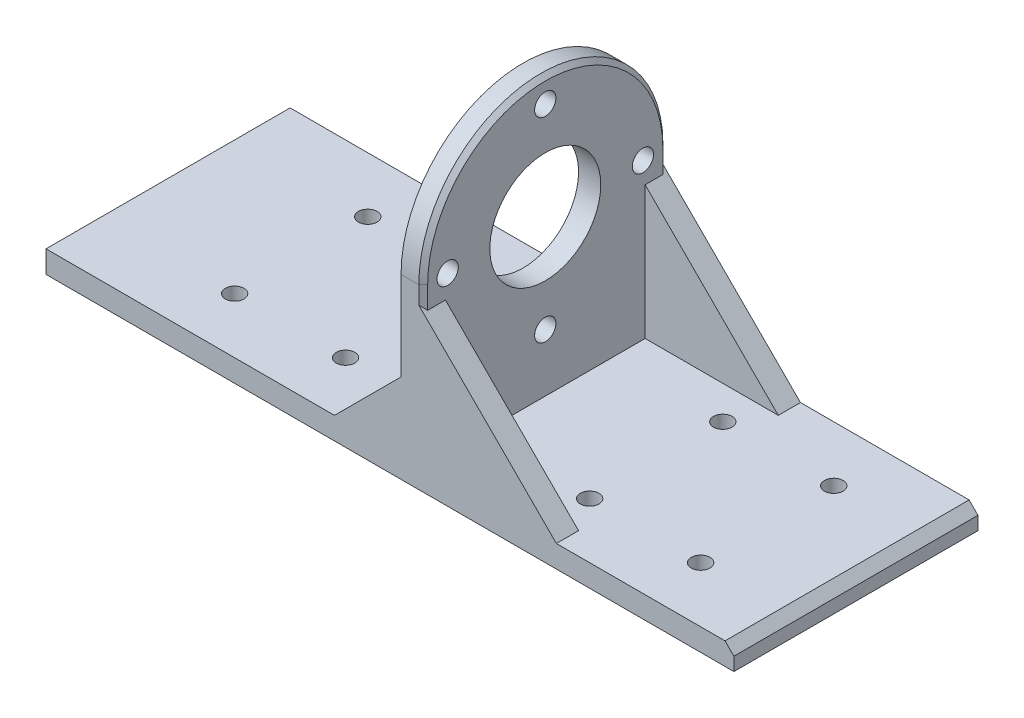
ISO-10303-21;
HEADER;
FILE_DESCRIPTION(('STEP AP214'),'2;1');
FILE_NAME('part.step','',(''),(''),'','','');
FILE_SCHEMA(('AUTOMOTIVE_DESIGN { 1 0 10303 214 1 1 1 1 }'));
ENDSEC;
DATA;
#1=APPLICATION_CONTEXT('core data for automotive mechanical design processes');
#2=APPLICATION_PROTOCOL_DEFINITION('international standard','automotive_design',2000,#1);
#3=PRODUCT_CONTEXT('',#1,'mechanical');
#4=PRODUCT('Part','Part','',(#3));
#5=PRODUCT_RELATED_PRODUCT_CATEGORY('part','',(#4));
#6=PRODUCT_DEFINITION_FORMATION('','',#4);
#7=PRODUCT_DEFINITION_CONTEXT('part definition',#1,'design');
#8=PRODUCT_DEFINITION('design','',#6,#7);
#9=PRODUCT_DEFINITION_SHAPE('','',#8);
#10=(LENGTH_UNIT() NAMED_UNIT(*) SI_UNIT(.MILLI.,.METRE.));
#11=(NAMED_UNIT(*) PLANE_ANGLE_UNIT() SI_UNIT($,.RADIAN.));
#12=(NAMED_UNIT(*) SI_UNIT($,.STERADIAN.) SOLID_ANGLE_UNIT());
#13=UNCERTAINTY_MEASURE_WITH_UNIT(LENGTH_MEASURE(1.E-05),#10,'distance_accuracy_value','');
#14=(GEOMETRIC_REPRESENTATION_CONTEXT(3) GLOBAL_UNCERTAINTY_ASSIGNED_CONTEXT((#13)) GLOBAL_UNIT_ASSIGNED_CONTEXT((#10,
#11,#12)) REPRESENTATION_CONTEXT('',''));
#15=CARTESIAN_POINT('',(0.,0.,0.));
#16=DIRECTION('',(0.,0.,1.));
#17=DIRECTION('',(1.,0.,0.));
#18=AXIS2_PLACEMENT_3D('',#15,#16,#17);
#19=CARTESIAN_POINT('',(5.,0.,0.));
#20=DIRECTION('',(1.,0.,0.));
#21=DIRECTION('',(0.,0.,-1.));
#22=AXIS2_PLACEMENT_3D('',#19,#20,#21);
#23=PLANE('',#22);
#24=DIRECTION('',(0.,0.,-1.));
#25=VECTOR('',#24,1.);
#26=CARTESIAN_POINT('',(5.,-5.00000000000001,0.));
#27=LINE('',#26,#25);
#28=CARTESIAN_POINT('',(5.,-5.00000000000001,-26.5));
#29=VERTEX_POINT('',#28);
#30=CARTESIAN_POINT('',(5.,-5.00000000000001,-22.5));
#31=VERTEX_POINT('',#30);
#32=EDGE_CURVE('E201',#29,#31,#27,.F.);
#33=ORIENTED_EDGE('',*,*,#32,.F.);
#34=DIRECTION('',(0.,1.,0.));
#35=VECTOR('',#34,1.);
#36=CARTESIAN_POINT('',(5.,0.,-26.5));
#37=LINE('',#36,#35);
#38=CARTESIAN_POINT('',(5.,0.,-26.5));
#39=VERTEX_POINT('',#38);
#40=EDGE_CURVE('E407',#29,#39,#37,.T.);
#41=ORIENTED_EDGE('',*,*,#40,.T.);
#42=CARTESIAN_POINT('',(5.,0.,0.));
#43=DIRECTION('',(1.,0.,0.));
#44=DIRECTION('',(0.,0.,-1.));
#45=AXIS2_PLACEMENT_3D('',#42,#43,#44);
#46=CIRCLE('',#45,26.5);
#47=CARTESIAN_POINT('',(5.,0.,26.5));
#48=VERTEX_POINT('',#47);
#49=EDGE_CURVE('E187',#39,#48,#46,.T.);
#50=ORIENTED_EDGE('',*,*,#49,.T.);
#51=DIRECTION('',(0.,-1.,0.));
#52=VECTOR('',#51,1.);
#53=CARTESIAN_POINT('',(5.,-5.00000000000002,26.5));
#54=LINE('',#53,#52);
#55=CARTESIAN_POINT('',(5.,-5.00000000000001,26.5));
#56=VERTEX_POINT('',#55);
#57=EDGE_CURVE('E404',#48,#56,#54,.T.);
#58=ORIENTED_EDGE('',*,*,#57,.T.);
#59=DIRECTION('',(0.,0.,1.));
#60=VECTOR('',#59,1.);
#61=CARTESIAN_POINT('',(5.,-5.00000000000001,0.));
#62=LINE('',#61,#60);
#63=CARTESIAN_POINT('',(5.,-5.00000000000001,22.5));
#64=VERTEX_POINT('',#63);
#65=EDGE_CURVE('E228',#64,#56,#62,.T.);
#66=ORIENTED_EDGE('',*,*,#65,.F.);
#67=DIRECTION('',(0.,-1.,0.));
#68=VECTOR('',#67,1.);
#69=CARTESIAN_POINT('',(5.,0.,22.5));
#70=LINE('',#69,#68);
#71=CARTESIAN_POINT('',(5.,-35.,22.5));
#72=VERTEX_POINT('',#71);
#73=EDGE_CURVE('E221',#64,#72,#70,.T.);
#74=ORIENTED_EDGE('',*,*,#73,.T.);
#75=DIRECTION('',(0.,0.,1.));
#76=VECTOR('',#75,1.);
#77=CARTESIAN_POINT('',(5.,-35.,27.5));
#78=LINE('',#77,#76);
#79=CARTESIAN_POINT('',(5.,-35.,-22.5));
#80=VERTEX_POINT('',#79);
#81=EDGE_CURVE('E232',#80,#72,#78,.T.);
#82=ORIENTED_EDGE('',*,*,#81,.F.);
#83=DIRECTION('',(0.,1.,0.));
#84=VECTOR('',#83,1.);
#85=CARTESIAN_POINT('',(5.,0.,-22.5));
#86=LINE('',#85,#84);
#87=EDGE_CURVE('E195',#80,#31,#86,.T.);
#88=ORIENTED_EDGE('',*,*,#87,.T.);
#89=EDGE_LOOP('',(#33,#41,#50,#58,#66,#74,#82,#88));
#90=FACE_BOUND('',#89,.T.);
#91=CARTESIAN_POINT('',(5.,-22.,0.));
#92=DIRECTION('',(1.,0.,0.));
#93=DIRECTION('',(0.,0.,-1.));
#94=AXIS2_PLACEMENT_3D('',#91,#92,#93);
#95=CIRCLE('',#94,2.4);
#96=CARTESIAN_POINT('',(5.,-22.,-2.4));
#97=VERTEX_POINT('',#96);
#98=EDGE_CURVE('E312',#97,#97,#95,.T.);
#99=ORIENTED_EDGE('',*,*,#98,.F.);
#100=EDGE_LOOP('',(#99));
#101=FACE_BOUND('',#100,.T.);
#102=CARTESIAN_POINT('',(5.,22.,0.));
#103=DIRECTION('',(1.,0.,0.));
#104=DIRECTION('',(0.,0.,-1.));
#105=AXIS2_PLACEMENT_3D('',#102,#103,#104);
#106=CIRCLE('',#105,2.4);
#107=CARTESIAN_POINT('',(5.,22.,-2.4));
#108=VERTEX_POINT('',#107);
#109=EDGE_CURVE('E328',#108,#108,#106,.T.);
#110=ORIENTED_EDGE('',*,*,#109,.F.);
#111=EDGE_LOOP('',(#110));
#112=FACE_BOUND('',#111,.T.);
#113=CARTESIAN_POINT('',(5.,0.,0.));
#114=DIRECTION('',(1.,0.,0.));
#115=DIRECTION('',(0.,0.,-1.));
#116=AXIS2_PLACEMENT_3D('',#113,#114,#115);
#117=CIRCLE('',#116,12.5);
#118=CARTESIAN_POINT('',(5.,0.,-12.5));
#119=VERTEX_POINT('',#118);
#120=EDGE_CURVE('E336',#119,#119,#117,.T.);
#121=ORIENTED_EDGE('',*,*,#120,.F.);
#122=EDGE_LOOP('',(#121));
#123=FACE_BOUND('',#122,.T.);
#124=CARTESIAN_POINT('',(5.,0.,-22.));
#125=DIRECTION('',(1.,0.,0.));
#126=DIRECTION('',(0.,0.,-1.));
#127=AXIS2_PLACEMENT_3D('',#124,#125,#126);
#128=CIRCLE('',#127,2.4);
#129=CARTESIAN_POINT('',(5.,0.,-24.4));
#130=VERTEX_POINT('',#129);
#131=EDGE_CURVE('E320',#130,#130,#128,.T.);
#132=ORIENTED_EDGE('',*,*,#131,.F.);
#133=EDGE_LOOP('',(#132));
#134=FACE_BOUND('',#133,.T.);
#135=CARTESIAN_POINT('',(5.,0.,22.));
#136=DIRECTION('',(1.,0.,0.));
#137=DIRECTION('',(0.,0.,-1.));
#138=AXIS2_PLACEMENT_3D('',#135,#136,#137);
#139=CIRCLE('',#138,2.4);
#140=CARTESIAN_POINT('',(5.,0.,19.6));
#141=VERTEX_POINT('',#140);
#142=EDGE_CURVE('E304',#141,#141,#139,.T.);
#143=ORIENTED_EDGE('',*,*,#142,.F.);
#144=EDGE_LOOP('',(#143));
#145=FACE_BOUND('',#144,.T.);
#146=ADVANCED_FACE('F42',(#90,#101,#112,#123,#134,#145),#23,.T.);
#147=CARTESIAN_POINT('',(0.,0.,0.));
#148=DIRECTION('',(1.,0.,0.));
#149=DIRECTION('',(0.,0.,-1.));
#150=AXIS2_PLACEMENT_3D('',#147,#148,#149);
#151=PLANE('',#150);
#152=CARTESIAN_POINT('',(0.,0.,-22.));
#153=DIRECTION('',(1.,0.,0.));
#154=DIRECTION('',(0.,0.,-1.));
#155=AXIS2_PLACEMENT_3D('',#152,#153,#154);
#156=CIRCLE('',#155,2.4);
#157=CARTESIAN_POINT('',(0.,0.,-24.4));
#158=VERTEX_POINT('',#157);
#159=EDGE_CURVE('E316',#158,#158,#156,.T.);
#160=ORIENTED_EDGE('',*,*,#159,.T.);
#161=EDGE_LOOP('',(#160));
#162=FACE_BOUND('',#161,.T.);
#163=CARTESIAN_POINT('',(0.,0.,0.));
#164=DIRECTION('',(1.,0.,0.));
#165=DIRECTION('',(0.,0.,-1.));
#166=AXIS2_PLACEMENT_3D('',#163,#164,#165);
#167=CIRCLE('',#166,27.5);
#168=CARTESIAN_POINT('',(0.,0.,-27.5));
#169=VERTEX_POINT('',#168);
#170=CARTESIAN_POINT('',(0.,0.,27.5));
#171=VERTEX_POINT('',#170);
#172=EDGE_CURVE('E340',#169,#171,#167,.T.);
#173=ORIENTED_EDGE('',*,*,#172,.F.);
#174=DIRECTION('',(0.,1.,0.));
#175=VECTOR('',#174,1.);
#176=CARTESIAN_POINT('',(0.,-40.,-27.5));
#177=LINE('',#176,#175);
#178=CARTESIAN_POINT('',(0.,-20.,-27.5));
#179=VERTEX_POINT('',#178);
#180=EDGE_CURVE('E351',#179,#169,#177,.T.);
#181=ORIENTED_EDGE('',*,*,#180,.F.);
#182=DIRECTION('',(0.,0.,1.));
#183=VECTOR('',#182,1.);
#184=CARTESIAN_POINT('',(0.,-20.,0.));
#185=LINE('',#184,#183);
#186=CARTESIAN_POINT('',(0.,-20.,-22.5));
#187=VERTEX_POINT('',#186);
#188=EDGE_CURVE('E262',#179,#187,#185,.T.);
#189=ORIENTED_EDGE('',*,*,#188,.T.);
#190=DIRECTION('',(0.,1.,0.));
#191=VECTOR('',#190,1.);
#192=CARTESIAN_POINT('',(0.,0.,-22.5));
#193=LINE('',#192,#191);
#194=CARTESIAN_POINT('',(0.,-33.,-22.5));
#195=VERTEX_POINT('',#194);
#196=EDGE_CURVE('E256',#195,#187,#193,.T.);
#197=ORIENTED_EDGE('',*,*,#196,.F.);
#198=DIRECTION('',(0.,0.,1.));
#199=VECTOR('',#198,1.);
#200=CARTESIAN_POINT('',(0.,-33.,0.));
#201=LINE('',#200,#199);
#202=CARTESIAN_POINT('',(0.,-33.,22.5));
#203=VERTEX_POINT('',#202);
#204=EDGE_CURVE('E382',#195,#203,#201,.T.);
#205=ORIENTED_EDGE('',*,*,#204,.T.);
#206=DIRECTION('',(0.,-1.,0.));
#207=VECTOR('',#206,1.);
#208=CARTESIAN_POINT('',(0.,0.,22.5));
#209=LINE('',#208,#207);
#210=CARTESIAN_POINT('',(0.,-20.,22.5));
#211=VERTEX_POINT('',#210);
#212=EDGE_CURVE('E270',#211,#203,#209,.T.);
#213=ORIENTED_EDGE('',*,*,#212,.F.);
#214=DIRECTION('',(0.,0.,-1.));
#215=VECTOR('',#214,1.);
#216=CARTESIAN_POINT('',(0.,-20.,0.));
#217=LINE('',#216,#215);
#218=CARTESIAN_POINT('',(0.,-20.,27.5));
#219=VERTEX_POINT('',#218);
#220=EDGE_CURVE('E277',#211,#219,#217,.F.);
#221=ORIENTED_EDGE('',*,*,#220,.T.);
#222=DIRECTION('',(0.,-1.,0.));
#223=VECTOR('',#222,1.);
#224=CARTESIAN_POINT('',(0.,0.,27.5));
#225=LINE('',#224,#223);
#226=EDGE_CURVE('E347',#171,#219,#225,.T.);
#227=ORIENTED_EDGE('',*,*,#226,.F.);
#228=EDGE_LOOP('',(#173,#181,#189,#197,#205,#213,#221,#227));
#229=FACE_BOUND('',#228,.T.);
#230=CARTESIAN_POINT('',(0.,0.,0.));
#231=DIRECTION('',(1.,0.,0.));
#232=DIRECTION('',(0.,0.,-1.));
#233=AXIS2_PLACEMENT_3D('',#230,#231,#232);
#234=CIRCLE('',#233,12.5);
#235=CARTESIAN_POINT('',(0.,0.,-12.5));
#236=VERTEX_POINT('',#235);
#237=EDGE_CURVE('E332',#236,#236,#234,.T.);
#238=ORIENTED_EDGE('',*,*,#237,.T.);
#239=EDGE_LOOP('',(#238));
#240=FACE_BOUND('',#239,.T.);
#241=CARTESIAN_POINT('',(0.,22.,0.));
#242=DIRECTION('',(1.,0.,0.));
#243=DIRECTION('',(0.,0.,-1.));
#244=AXIS2_PLACEMENT_3D('',#241,#242,#243);
#245=CIRCLE('',#244,2.4);
#246=CARTESIAN_POINT('',(0.,22.,-2.4));
#247=VERTEX_POINT('',#246);
#248=EDGE_CURVE('E324',#247,#247,#245,.T.);
#249=ORIENTED_EDGE('',*,*,#248,.T.);
#250=EDGE_LOOP('',(#249));
#251=FACE_BOUND('',#250,.T.);
#252=CARTESIAN_POINT('',(0.,-22.,0.));
#253=DIRECTION('',(1.,0.,0.));
#254=DIRECTION('',(0.,0.,-1.));
#255=AXIS2_PLACEMENT_3D('',#252,#253,#254);
#256=CIRCLE('',#255,2.4);
#257=CARTESIAN_POINT('',(0.,-22.,-2.4));
#258=VERTEX_POINT('',#257);
#259=EDGE_CURVE('E308',#258,#258,#256,.T.);
#260=ORIENTED_EDGE('',*,*,#259,.T.);
#261=EDGE_LOOP('',(#260));
#262=FACE_BOUND('',#261,.T.);
#263=CARTESIAN_POINT('',(0.,0.,22.));
#264=DIRECTION('',(1.,0.,0.));
#265=DIRECTION('',(0.,0.,-1.));
#266=AXIS2_PLACEMENT_3D('',#263,#264,#265);
#267=CIRCLE('',#266,2.4);
#268=CARTESIAN_POINT('',(0.,0.,19.6));
#269=VERTEX_POINT('',#268);
#270=EDGE_CURVE('E300',#269,#269,#267,.T.);
#271=ORIENTED_EDGE('',*,*,#270,.T.);
#272=EDGE_LOOP('',(#271));
#273=FACE_BOUND('',#272,.T.);
#274=ADVANCED_FACE('F467',(#162,#229,#240,#251,#262,#273),#151,.F.);
#275=CARTESIAN_POINT('',(5.,0.,0.));
#276=DIRECTION('',(-1.,0.,0.));
#277=DIRECTION('',(0.,0.,1.));
#278=AXIS2_PLACEMENT_3D('',#275,#276,#277);
#279=CYLINDRICAL_SURFACE('',#278,27.5);
#280=DIRECTION('',(-1.,0.,0.));
#281=VECTOR('',#280,1.);
#282=CARTESIAN_POINT('',(5.,0.,27.5));
#283=LINE('',#282,#281);
#284=CARTESIAN_POINT('',(3.99999999999999,0.,27.5));
#285=VERTEX_POINT('',#284);
#286=EDGE_CURVE('E365',#285,#171,#283,.T.);
#287=ORIENTED_EDGE('',*,*,#286,.F.);
#288=CARTESIAN_POINT('',(3.99999999999999,0.,0.));
#289=DIRECTION('',(1.,0.,0.));
#290=DIRECTION('',(0.,0.,-1.));
#291=AXIS2_PLACEMENT_3D('',#288,#289,#290);
#292=CIRCLE('',#291,27.5);
#293=CARTESIAN_POINT('',(3.99999999999999,0.,-27.5));
#294=VERTEX_POINT('',#293);
#295=EDGE_CURVE('E418',#285,#294,#292,.F.);
#296=ORIENTED_EDGE('',*,*,#295,.T.);
#297=DIRECTION('',(-1.,0.,0.));
#298=VECTOR('',#297,1.);
#299=CARTESIAN_POINT('',(5.,0.,-27.5));
#300=LINE('',#299,#298);
#301=EDGE_CURVE('E355',#294,#169,#300,.T.);
#302=ORIENTED_EDGE('',*,*,#301,.T.);
#303=ORIENTED_EDGE('',*,*,#172,.T.);
#304=EDGE_LOOP('',(#287,#296,#302,#303));
#305=FACE_BOUND('',#304,.T.);
#306=ADVANCED_FACE('F473',(#305),#279,.T.);
#307=CARTESIAN_POINT('',(5.,0.,27.5));
#308=DIRECTION('',(0.,0.,-1.));
#309=DIRECTION('',(0.,1.,0.));
#310=AXIS2_PLACEMENT_3D('',#307,#308,#309);
#311=PLANE('',#310);
#312=DIRECTION('',(0.,-1.,0.));
#313=VECTOR('',#312,1.);
#314=CARTESIAN_POINT('',(75.,-40.,27.5));
#315=LINE('',#314,#313);
#316=CARTESIAN_POINT('',(75.,-37.,27.5));
#317=VERTEX_POINT('',#316);
#318=CARTESIAN_POINT('',(75.,-40.,27.5));
#319=VERTEX_POINT('',#318);
#320=EDGE_CURVE('E233',#317,#319,#315,.T.);
#321=ORIENTED_EDGE('',*,*,#320,.F.);
#322=DIRECTION('',(0.707106781186548,-0.707106781186548,0.));
#323=VECTOR('',#322,1.);
#324=CARTESIAN_POINT('',(75.,-37.,27.5));
#325=LINE('',#324,#323);
#326=CARTESIAN_POINT('',(73.,-35.,27.5));
#327=VERTEX_POINT('',#326);
#328=EDGE_CURVE('E66',#317,#327,#325,.F.);
#329=ORIENTED_EDGE('',*,*,#328,.T.);
#330=DIRECTION('',(-1.,0.,0.));
#331=VECTOR('',#330,1.);
#332=CARTESIAN_POINT('',(75.,-35.,27.5));
#333=LINE('',#332,#331);
#334=CARTESIAN_POINT('',(35.,-35.,27.5));
#335=VERTEX_POINT('',#334);
#336=EDGE_CURVE('E244',#327,#335,#333,.T.);
#337=ORIENTED_EDGE('',*,*,#336,.T.);
#338=DIRECTION('',(-0.707106781186548,0.707106781186547,0.));
#339=VECTOR('',#338,1.);
#340=CARTESIAN_POINT('',(35.,-35.,27.5));
#341=LINE('',#340,#339);
#342=CARTESIAN_POINT('',(3.99999999999999,-4.,27.5));
#343=VERTEX_POINT('',#342);
#344=EDGE_CURVE('E218',#335,#343,#341,.T.);
#345=ORIENTED_EDGE('',*,*,#344,.T.);
#346=DIRECTION('',(0.,1.,0.));
#347=VECTOR('',#346,1.);
#348=CARTESIAN_POINT('',(3.99999999999999,0.,27.5));
#349=LINE('',#348,#347);
#350=EDGE_CURVE('E415',#343,#285,#349,.T.);
#351=ORIENTED_EDGE('',*,*,#350,.T.);
#352=ORIENTED_EDGE('',*,*,#286,.T.);
#353=ORIENTED_EDGE('',*,*,#226,.T.);
#354=DIRECTION('',(0.707106781186548,0.707106781186547,0.));
#355=VECTOR('',#354,1.);
#356=CARTESIAN_POINT('',(-15.,-35.,27.5));
#357=LINE('',#356,#355);
#358=CARTESIAN_POINT('',(-15.,-35.,27.5));
#359=VERTEX_POINT('',#358);
#360=EDGE_CURVE('E267',#359,#219,#357,.T.);
#361=ORIENTED_EDGE('',*,*,#360,.F.);
#362=DIRECTION('',(1.,0.,0.));
#363=VECTOR('',#362,1.);
#364=CARTESIAN_POINT('',(-80.,-35.,27.5));
#365=LINE('',#364,#363);
#366=CARTESIAN_POINT('',(-80.,-35.,27.5));
#367=VERTEX_POINT('',#366);
#368=EDGE_CURVE('E296',#367,#359,#365,.T.);
#369=ORIENTED_EDGE('',*,*,#368,.F.);
#370=DIRECTION('',(0.,1.,0.));
#371=VECTOR('',#370,1.);
#372=CARTESIAN_POINT('',(-80.,-40.,27.5));
#373=LINE('',#372,#371);
#374=CARTESIAN_POINT('',(-80.,-40.,27.5));
#375=VERTEX_POINT('',#374);
#376=EDGE_CURVE('E288',#375,#367,#373,.T.);
#377=ORIENTED_EDGE('',*,*,#376,.F.);
#378=DIRECTION('',(-1.,0.,0.));
#379=VECTOR('',#378,1.);
#380=CARTESIAN_POINT('',(5.,-40.,27.5));
#381=LINE('',#380,#379);
#382=EDGE_CURVE('E361',#319,#375,#381,.T.);
#383=ORIENTED_EDGE('',*,*,#382,.F.);
#384=EDGE_LOOP('',(#321,#329,#337,#345,#351,#352,#353,#361,#369,#377,#383));
#385=FACE_BOUND('',#384,.T.);
#386=ADVANCED_FACE('F449',(#385),#311,.F.);
#387=CARTESIAN_POINT('',(5.,-40.,27.5));
#388=DIRECTION('',(0.,1.,0.));
#389=DIRECTION('',(0.,0.,1.));
#390=AXIS2_PLACEMENT_3D('',#387,#388,#389);
#391=PLANE('',#390);
#392=CARTESIAN_POINT('',(55.,-40.,15.));
#393=DIRECTION('',(0.,1.,0.));
#394=DIRECTION('',(0.,0.,1.));
#395=AXIS2_PLACEMENT_3D('',#392,#393,#394);
#396=CIRCLE('',#395,2.1);
#397=CARTESIAN_POINT('',(55.,-40.,17.1));
#398=VERTEX_POINT('',#397);
#399=EDGE_CURVE('E917',#398,#398,#396,.F.);
#400=ORIENTED_EDGE('',*,*,#399,.F.);
#401=EDGE_LOOP('',(#400));
#402=FACE_BOUND('',#401,.T.);
#403=CARTESIAN_POINT('',(-25.,-40.,-15.));
#404=DIRECTION('',(0.,1.,0.));
#405=DIRECTION('',(0.,0.,1.));
#406=AXIS2_PLACEMENT_3D('',#403,#404,#405);
#407=CIRCLE('',#406,2.1);
#408=CARTESIAN_POINT('',(-25.,-40.,-12.9));
#409=VERTEX_POINT('',#408);
#410=EDGE_CURVE('E913',#409,#409,#407,.F.);
#411=ORIENTED_EDGE('',*,*,#410,.F.);
#412=EDGE_LOOP('',(#411));
#413=FACE_BOUND('',#412,.T.);
#414=CARTESIAN_POINT('',(-50.,-40.,-15.));
#415=DIRECTION('',(0.,1.,0.));
#416=DIRECTION('',(0.,0.,1.));
#417=AXIS2_PLACEMENT_3D('',#414,#415,#416);
#418=CIRCLE('',#417,2.1);
#419=CARTESIAN_POINT('',(-50.,-40.,-12.9));
#420=VERTEX_POINT('',#419);
#421=EDGE_CURVE('E906',#420,#420,#418,.F.);
#422=ORIENTED_EDGE('',*,*,#421,.F.);
#423=EDGE_LOOP('',(#422));
#424=FACE_BOUND('',#423,.T.);
#425=CARTESIAN_POINT('',(55.,-40.,-15.));
#426=DIRECTION('',(0.,1.,0.));
#427=DIRECTION('',(0.,0.,1.));
#428=AXIS2_PLACEMENT_3D('',#425,#426,#427);
#429=CIRCLE('',#428,2.1);
#430=CARTESIAN_POINT('',(55.,-40.,-12.9));
#431=VERTEX_POINT('',#430);
#432=EDGE_CURVE('E900',#431,#431,#429,.F.);
#433=ORIENTED_EDGE('',*,*,#432,.F.);
#434=EDGE_LOOP('',(#433));
#435=FACE_BOUND('',#434,.T.);
#436=CARTESIAN_POINT('',(30.,-40.,15.));
#437=DIRECTION('',(0.,1.,0.));
#438=DIRECTION('',(0.,0.,1.));
#439=AXIS2_PLACEMENT_3D('',#436,#437,#438);
#440=CIRCLE('',#439,2.1);
#441=CARTESIAN_POINT('',(30.,-40.,17.1));
#442=VERTEX_POINT('',#441);
#443=EDGE_CURVE('E924',#442,#442,#440,.F.);
#444=ORIENTED_EDGE('',*,*,#443,.F.);
#445=EDGE_LOOP('',(#444));
#446=FACE_BOUND('',#445,.T.);
#447=CARTESIAN_POINT('',(-25.,-40.,15.));
#448=DIRECTION('',(0.,1.,0.));
#449=DIRECTION('',(0.,0.,1.));
#450=AXIS2_PLACEMENT_3D('',#447,#448,#449);
#451=CIRCLE('',#450,2.1);
#452=CARTESIAN_POINT('',(-25.,-40.,17.1));
#453=VERTEX_POINT('',#452);
#454=EDGE_CURVE('E939',#453,#453,#451,.F.);
#455=ORIENTED_EDGE('',*,*,#454,.F.);
#456=EDGE_LOOP('',(#455));
#457=FACE_BOUND('',#456,.T.);
#458=CARTESIAN_POINT('',(-50.,-40.,15.));
#459=DIRECTION('',(0.,1.,0.));
#460=DIRECTION('',(0.,0.,1.));
#461=AXIS2_PLACEMENT_3D('',#458,#459,#460);
#462=CIRCLE('',#461,2.1);
#463=CARTESIAN_POINT('',(-50.,-40.,17.1));
#464=VERTEX_POINT('',#463);
#465=EDGE_CURVE('E931',#464,#464,#462,.F.);
#466=ORIENTED_EDGE('',*,*,#465,.F.);
#467=EDGE_LOOP('',(#466));
#468=FACE_BOUND('',#467,.T.);
#469=CARTESIAN_POINT('',(30.,-40.,-15.));
#470=DIRECTION('',(0.,1.,0.));
#471=DIRECTION('',(0.,0.,1.));
#472=AXIS2_PLACEMENT_3D('',#469,#470,#471);
#473=CIRCLE('',#472,2.1);
#474=CARTESIAN_POINT('',(30.,-40.,-12.9));
#475=VERTEX_POINT('',#474);
#476=EDGE_CURVE('E204',#475,#475,#473,.F.);
#477=ORIENTED_EDGE('',*,*,#476,.F.);
#478=EDGE_LOOP('',(#477));
#479=FACE_BOUND('',#478,.T.);
#480=DIRECTION('',(0.,0.,1.));
#481=VECTOR('',#480,1.);
#482=CARTESIAN_POINT('',(-80.,-40.,-27.5));
#483=LINE('',#482,#481);
#484=CARTESIAN_POINT('',(-80.,-40.,-27.5));
#485=VERTEX_POINT('',#484);
#486=EDGE_CURVE('E292',#485,#375,#483,.T.);
#487=ORIENTED_EDGE('',*,*,#486,.F.);
#488=DIRECTION('',(-1.,0.,0.));
#489=VECTOR('',#488,1.);
#490=CARTESIAN_POINT('',(5.,-40.,-27.5));
#491=LINE('',#490,#489);
#492=CARTESIAN_POINT('',(75.,-40.,-27.5));
#493=VERTEX_POINT('',#492);
#494=EDGE_CURVE('E358',#493,#485,#491,.T.);
#495=ORIENTED_EDGE('',*,*,#494,.F.);
#496=DIRECTION('',(0.,0.,-1.));
#497=VECTOR('',#496,1.);
#498=CARTESIAN_POINT('',(75.,-40.,27.5));
#499=LINE('',#498,#497);
#500=EDGE_CURVE('E236',#319,#493,#499,.T.);
#501=ORIENTED_EDGE('',*,*,#500,.F.);
#502=ORIENTED_EDGE('',*,*,#382,.T.);
#503=EDGE_LOOP('',(#487,#495,#501,#502));
#504=FACE_BOUND('',#503,.T.);
#505=ADVANCED_FACE('F455',(#402,#413,#424,#435,#446,#457,#468,#479,#504),#391,.F.);
#506=CARTESIAN_POINT('',(5.,-40.,-27.5));
#507=DIRECTION('',(0.,0.,1.));
#508=DIRECTION('',(0.,-1.,0.));
#509=AXIS2_PLACEMENT_3D('',#506,#507,#508);
#510=PLANE('',#509);
#511=DIRECTION('',(-1.,0.,0.));
#512=VECTOR('',#511,1.);
#513=CARTESIAN_POINT('',(75.,-35.,-27.5));
#514=LINE('',#513,#512);
#515=CARTESIAN_POINT('',(73.,-35.,-27.5));
#516=VERTEX_POINT('',#515);
#517=CARTESIAN_POINT('',(35.,-35.,-27.5));
#518=VERTEX_POINT('',#517);
#519=EDGE_CURVE('E182',#516,#518,#514,.T.);
#520=ORIENTED_EDGE('',*,*,#519,.F.);
#521=DIRECTION('',(-0.707106781186548,0.707106781186548,0.));
#522=VECTOR('',#521,1.);
#523=CARTESIAN_POINT('',(75.,-37.,-27.5));
#524=LINE('',#523,#522);
#525=CARTESIAN_POINT('',(75.,-37.,-27.5));
#526=VERTEX_POINT('',#525);
#527=EDGE_CURVE('E11',#516,#526,#524,.F.);
#528=ORIENTED_EDGE('',*,*,#527,.T.);
#529=DIRECTION('',(0.,1.,0.));
#530=VECTOR('',#529,1.);
#531=CARTESIAN_POINT('',(75.,-40.,-27.5));
#532=LINE('',#531,#530);
#533=EDGE_CURVE('E240',#493,#526,#532,.T.);
#534=ORIENTED_EDGE('',*,*,#533,.F.);
#535=ORIENTED_EDGE('',*,*,#494,.T.);
#536=DIRECTION('',(0.,1.,0.));
#537=VECTOR('',#536,1.);
#538=CARTESIAN_POINT('',(-80.,-40.,-27.5));
#539=LINE('',#538,#537);
#540=CARTESIAN_POINT('',(-80.,-35.,-27.5));
#541=VERTEX_POINT('',#540);
#542=EDGE_CURVE('E281',#485,#541,#539,.T.);
#543=ORIENTED_EDGE('',*,*,#542,.T.);
#544=DIRECTION('',(1.,0.,0.));
#545=VECTOR('',#544,1.);
#546=CARTESIAN_POINT('',(-80.,-35.,-27.5));
#547=LINE('',#546,#545);
#548=CARTESIAN_POINT('',(-15.,-35.,-27.5));
#549=VERTEX_POINT('',#548);
#550=EDGE_CURVE('E295',#541,#549,#547,.T.);
#551=ORIENTED_EDGE('',*,*,#550,.T.);
#552=DIRECTION('',(0.707106781186548,0.707106781186547,0.));
#553=VECTOR('',#552,1.);
#554=CARTESIAN_POINT('',(-15.,-35.,-27.5));
#555=LINE('',#554,#553);
#556=EDGE_CURVE('E252',#549,#179,#555,.T.);
#557=ORIENTED_EDGE('',*,*,#556,.T.);
#558=ORIENTED_EDGE('',*,*,#180,.T.);
#559=ORIENTED_EDGE('',*,*,#301,.F.);
#560=DIRECTION('',(0.,-1.,0.));
#561=VECTOR('',#560,1.);
#562=CARTESIAN_POINT('',(3.99999999999999,-5.00000000000002,-27.5));
#563=LINE('',#562,#561);
#564=CARTESIAN_POINT('',(4.,-4.00000000000001,-27.5));
#565=VERTEX_POINT('',#564);
#566=EDGE_CURVE('E411',#294,#565,#563,.T.);
#567=ORIENTED_EDGE('',*,*,#566,.T.);
#568=DIRECTION('',(-0.707106781186548,0.707106781186547,0.));
#569=VECTOR('',#568,1.);
#570=CARTESIAN_POINT('',(35.,-35.,-27.5));
#571=LINE('',#570,#569);
#572=EDGE_CURVE('E203',#518,#565,#571,.T.);
#573=ORIENTED_EDGE('',*,*,#572,.F.);
#574=EDGE_LOOP('',(#520,#528,#534,#535,#543,#551,#557,#558,#559,#567,#573));
#575=FACE_BOUND('',#574,.T.);
#576=ADVANCED_FACE('F457',(#575),#510,.F.);
#577=CARTESIAN_POINT('',(5.,0.,0.));
#578=DIRECTION('',(-1.,0.,0.));
#579=DIRECTION('',(0.,0.,1.));
#580=AXIS2_PLACEMENT_3D('',#577,#578,#579);
#581=CYLINDRICAL_SURFACE('',#580,12.5);
#582=ORIENTED_EDGE('',*,*,#120,.T.);
#583=EDGE_LOOP('',(#582));
#584=FACE_BOUND('',#583,.T.);
#585=ORIENTED_EDGE('',*,*,#237,.F.);
#586=EDGE_LOOP('',(#585));
#587=FACE_BOUND('',#586,.T.);
#588=ADVANCED_FACE('F478',(#584,#587),#581,.F.);
#589=CARTESIAN_POINT('',(5.,22.,0.));
#590=DIRECTION('',(-1.,0.,0.));
#591=DIRECTION('',(0.,0.,1.));
#592=AXIS2_PLACEMENT_3D('',#589,#590,#591);
#593=CYLINDRICAL_SURFACE('',#592,2.4);
#594=ORIENTED_EDGE('',*,*,#109,.T.);
#595=EDGE_LOOP('',(#594));
#596=FACE_BOUND('',#595,.T.);
#597=ORIENTED_EDGE('',*,*,#248,.F.);
#598=EDGE_LOOP('',(#597));
#599=FACE_BOUND('',#598,.T.);
#600=ADVANCED_FACE('F579',(#596,#599),#593,.F.);
#601=CARTESIAN_POINT('',(5.,0.,-22.));
#602=DIRECTION('',(-1.,0.,0.));
#603=DIRECTION('',(0.,0.,1.));
#604=AXIS2_PLACEMENT_3D('',#601,#602,#603);
#605=CYLINDRICAL_SURFACE('',#604,2.4);
#606=ORIENTED_EDGE('',*,*,#159,.F.);
#607=EDGE_LOOP('',(#606));
#608=FACE_BOUND('',#607,.T.);
#609=ORIENTED_EDGE('',*,*,#131,.T.);
#610=EDGE_LOOP('',(#609));
#611=FACE_BOUND('',#610,.T.);
#612=ADVANCED_FACE('F576',(#608,#611),#605,.F.);
#613=CARTESIAN_POINT('',(5.,-22.,0.));
#614=DIRECTION('',(-1.,0.,0.));
#615=DIRECTION('',(0.,0.,1.));
#616=AXIS2_PLACEMENT_3D('',#613,#614,#615);
#617=CYLINDRICAL_SURFACE('',#616,2.4);
#618=ORIENTED_EDGE('',*,*,#98,.T.);
#619=EDGE_LOOP('',(#618));
#620=FACE_BOUND('',#619,.T.);
#621=ORIENTED_EDGE('',*,*,#259,.F.);
#622=EDGE_LOOP('',(#621));
#623=FACE_BOUND('',#622,.T.);
#624=ADVANCED_FACE('F572',(#620,#623),#617,.F.);
#625=CARTESIAN_POINT('',(5.,0.,22.));
#626=DIRECTION('',(-1.,0.,0.));
#627=DIRECTION('',(0.,0.,1.));
#628=AXIS2_PLACEMENT_3D('',#625,#626,#627);
#629=CYLINDRICAL_SURFACE('',#628,2.4);
#630=ORIENTED_EDGE('',*,*,#270,.F.);
#631=EDGE_LOOP('',(#630));
#632=FACE_BOUND('',#631,.T.);
#633=ORIENTED_EDGE('',*,*,#142,.T.);
#634=EDGE_LOOP('',(#633));
#635=FACE_BOUND('',#634,.T.);
#636=ADVANCED_FACE('F565',(#632,#635),#629,.F.);
#637=CARTESIAN_POINT('',(-80.,-35.,-27.5));
#638=DIRECTION('',(0.,1.,0.));
#639=DIRECTION('',(0.,0.,1.));
#640=AXIS2_PLACEMENT_3D('',#637,#638,#639);
#641=PLANE('',#640);
#642=CARTESIAN_POINT('',(-25.,-35.,-15.));
#643=DIRECTION('',(0.,1.,0.));
#644=DIRECTION('',(0.,0.,1.));
#645=AXIS2_PLACEMENT_3D('',#642,#643,#644);
#646=CIRCLE('',#645,2.1);
#647=CARTESIAN_POINT('',(-25.,-35.,-12.9));
#648=VERTEX_POINT('',#647);
#649=EDGE_CURVE('E921',#648,#648,#646,.T.);
#650=ORIENTED_EDGE('',*,*,#649,.F.);
#651=EDGE_LOOP('',(#650));
#652=FACE_BOUND('',#651,.T.);
#653=CARTESIAN_POINT('',(-50.,-35.,-15.));
#654=DIRECTION('',(0.,1.,0.));
#655=DIRECTION('',(0.,0.,1.));
#656=AXIS2_PLACEMENT_3D('',#653,#654,#655);
#657=CIRCLE('',#656,2.1);
#658=CARTESIAN_POINT('',(-50.,-35.,-12.9));
#659=VERTEX_POINT('',#658);
#660=EDGE_CURVE('E910',#659,#659,#657,.T.);
#661=ORIENTED_EDGE('',*,*,#660,.F.);
#662=EDGE_LOOP('',(#661));
#663=FACE_BOUND('',#662,.T.);
#664=CARTESIAN_POINT('',(-25.,-35.,15.));
#665=DIRECTION('',(0.,1.,0.));
#666=DIRECTION('',(0.,0.,-1.));
#667=AXIS2_PLACEMENT_3D('',#664,#665,#666);
#668=CIRCLE('',#667,2.1);
#669=CARTESIAN_POINT('',(-25.,-35.,12.9));
#670=VERTEX_POINT('',#669);
#671=EDGE_CURVE('E935',#670,#670,#668,.T.);
#672=ORIENTED_EDGE('',*,*,#671,.F.);
#673=EDGE_LOOP('',(#672));
#674=FACE_BOUND('',#673,.T.);
#675=CARTESIAN_POINT('',(-50.,-35.,15.));
#676=DIRECTION('',(0.,1.,0.));
#677=DIRECTION('',(0.,0.,-1.));
#678=AXIS2_PLACEMENT_3D('',#675,#676,#677);
#679=CIRCLE('',#678,2.1);
#680=CARTESIAN_POINT('',(-50.,-35.,12.9));
#681=VERTEX_POINT('',#680);
#682=EDGE_CURVE('E436',#681,#681,#679,.T.);
#683=ORIENTED_EDGE('',*,*,#682,.F.);
#684=EDGE_LOOP('',(#683));
#685=FACE_BOUND('',#684,.T.);
#686=DIRECTION('',(0.,0.,1.));
#687=VECTOR('',#686,1.);
#688=CARTESIAN_POINT('',(-80.,-35.,-27.5));
#689=LINE('',#688,#687);
#690=EDGE_CURVE('E285',#541,#367,#689,.T.);
#691=ORIENTED_EDGE('',*,*,#690,.T.);
#692=ORIENTED_EDGE('',*,*,#368,.T.);
#693=DIRECTION('',(0.,0.,-1.));
#694=VECTOR('',#693,1.);
#695=CARTESIAN_POINT('',(-15.,-35.,-27.5));
#696=LINE('',#695,#694);
#697=CARTESIAN_POINT('',(-15.,-35.,22.5));
#698=VERTEX_POINT('',#697);
#699=EDGE_CURVE('E372',#698,#359,#696,.F.);
#700=ORIENTED_EDGE('',*,*,#699,.F.);
#701=DIRECTION('',(1.,0.,0.));
#702=VECTOR('',#701,1.);
#703=CARTESIAN_POINT('',(-80.,-35.,22.5));
#704=LINE('',#703,#702);
#705=CARTESIAN_POINT('',(-1.99999999999999,-35.,22.5));
#706=VERTEX_POINT('',#705);
#707=EDGE_CURVE('E368',#698,#706,#704,.T.);
#708=ORIENTED_EDGE('',*,*,#707,.T.);
#709=DIRECTION('',(0.,0.,-1.));
#710=VECTOR('',#709,1.);
#711=CARTESIAN_POINT('',(-1.99999999999999,-35.,-27.5));
#712=LINE('',#711,#710);
#713=CARTESIAN_POINT('',(-1.99999999999999,-35.,-22.5));
#714=VERTEX_POINT('',#713);
#715=EDGE_CURVE('E389',#706,#714,#712,.T.);
#716=ORIENTED_EDGE('',*,*,#715,.T.);
#717=DIRECTION('',(-1.,0.,0.));
#718=VECTOR('',#717,1.);
#719=CARTESIAN_POINT('',(-80.,-35.,-22.5));
#720=LINE('',#719,#718);
#721=CARTESIAN_POINT('',(-15.,-35.,-22.5));
#722=VERTEX_POINT('',#721);
#723=EDGE_CURVE('E375',#714,#722,#720,.T.);
#724=ORIENTED_EDGE('',*,*,#723,.T.);
#725=DIRECTION('',(0.,0.,1.));
#726=VECTOR('',#725,1.);
#727=CARTESIAN_POINT('',(-15.,-35.,-27.5));
#728=LINE('',#727,#726);
#729=EDGE_CURVE('E378',#549,#722,#728,.T.);
#730=ORIENTED_EDGE('',*,*,#729,.F.);
#731=ORIENTED_EDGE('',*,*,#550,.F.);
#732=EDGE_LOOP('',(#691,#692,#700,#708,#716,#724,#730,#731));
#733=FACE_BOUND('',#732,.T.);
#734=ADVANCED_FACE('F550',(#652,#663,#674,#685,#733),#641,.T.);
#735=CARTESIAN_POINT('',(-80.,0.,0.));
#736=DIRECTION('',(1.,0.,0.));
#737=DIRECTION('',(0.,0.,-1.));
#738=AXIS2_PLACEMENT_3D('',#735,#736,#737);
#739=PLANE('',#738);
#740=ORIENTED_EDGE('',*,*,#486,.T.);
#741=ORIENTED_EDGE('',*,*,#376,.T.);
#742=ORIENTED_EDGE('',*,*,#690,.F.);
#743=ORIENTED_EDGE('',*,*,#542,.F.);
#744=EDGE_LOOP('',(#740,#741,#742,#743));
#745=FACE_BOUND('',#744,.T.);
#746=ADVANCED_FACE('F555',(#745),#739,.F.);
#747=CARTESIAN_POINT('',(-15.,-35.,25.));
#748=DIRECTION('',(0.707106781186547,-0.707106781186548,0.));
#749=DIRECTION('',(0.707106781186548,0.707106781186547,0.));
#750=AXIS2_PLACEMENT_3D('',#747,#748,#749);
#751=PLANE('',#750);
#752=ORIENTED_EDGE('',*,*,#220,.F.);
#753=DIRECTION('',(0.707106781186548,0.707106781186547,0.));
#754=VECTOR('',#753,1.);
#755=CARTESIAN_POINT('',(-15.,-35.,22.5));
#756=LINE('',#755,#754);
#757=EDGE_CURVE('E266',#698,#211,#756,.T.);
#758=ORIENTED_EDGE('',*,*,#757,.F.);
#759=ORIENTED_EDGE('',*,*,#699,.T.);
#760=ORIENTED_EDGE('',*,*,#360,.T.);
#761=EDGE_LOOP('',(#752,#758,#759,#760));
#762=FACE_BOUND('',#761,.T.);
#763=ADVANCED_FACE('F557',(#762),#751,.F.);
#764=CARTESIAN_POINT('',(-37.5,-6.25,22.5));
#765=DIRECTION('',(0.,0.,1.));
#766=DIRECTION('',(1.,0.,0.));
#767=AXIS2_PLACEMENT_3D('',#764,#765,#766);
#768=PLANE('',#767);
#769=ORIENTED_EDGE('',*,*,#212,.T.);
#770=DIRECTION('',(-0.707106781186543,-0.707106781186552,0.));
#771=VECTOR('',#770,1.);
#772=CARTESIAN_POINT('',(0.,-33.,22.5));
#773=LINE('',#772,#771);
#774=EDGE_CURVE('E386',#203,#706,#773,.T.);
#775=ORIENTED_EDGE('',*,*,#774,.T.);
#776=ORIENTED_EDGE('',*,*,#707,.F.);
#777=ORIENTED_EDGE('',*,*,#757,.T.);
#778=EDGE_LOOP('',(#769,#775,#776,#777));
#779=FACE_BOUND('',#778,.T.);
#780=ADVANCED_FACE('F563',(#779),#768,.F.);
#781=CARTESIAN_POINT('',(-15.,-35.,-25.));
#782=DIRECTION('',(-0.707106781186547,0.707106781186548,0.));
#783=DIRECTION('',(0.707106781186548,0.707106781186547,0.));
#784=AXIS2_PLACEMENT_3D('',#781,#782,#783);
#785=PLANE('',#784);
#786=ORIENTED_EDGE('',*,*,#188,.F.);
#787=ORIENTED_EDGE('',*,*,#556,.F.);
#788=ORIENTED_EDGE('',*,*,#729,.T.);
#789=DIRECTION('',(0.707106781186548,0.707106781186547,0.));
#790=VECTOR('',#789,1.);
#791=CARTESIAN_POINT('',(-15.,-35.,-22.5));
#792=LINE('',#791,#790);
#793=EDGE_CURVE('E251',#722,#187,#792,.T.);
#794=ORIENTED_EDGE('',*,*,#793,.T.);
#795=EDGE_LOOP('',(#786,#787,#788,#794));
#796=FACE_BOUND('',#795,.T.);
#797=ADVANCED_FACE('F778',(#796),#785,.T.);
#798=CARTESIAN_POINT('',(-37.5,-6.25,-22.5));
#799=DIRECTION('',(0.,0.,-1.));
#800=DIRECTION('',(-1.,0.,0.));
#801=AXIS2_PLACEMENT_3D('',#798,#799,#800);
#802=PLANE('',#801);
#803=ORIENTED_EDGE('',*,*,#723,.F.);
#804=DIRECTION('',(0.707106781186543,0.707106781186552,0.));
#805=VECTOR('',#804,1.);
#806=CARTESIAN_POINT('',(0.,-33.,-22.5));
#807=LINE('',#806,#805);
#808=EDGE_CURVE('E392',#714,#195,#807,.T.);
#809=ORIENTED_EDGE('',*,*,#808,.T.);
#810=ORIENTED_EDGE('',*,*,#196,.T.);
#811=ORIENTED_EDGE('',*,*,#793,.F.);
#812=EDGE_LOOP('',(#803,#809,#810,#811));
#813=FACE_BOUND('',#812,.T.);
#814=ADVANCED_FACE('F497',(#813),#802,.F.);
#815=CARTESIAN_POINT('',(0.,-33.,0.));
#816=DIRECTION('',(0.707106781186552,-0.707106781186543,0.));
#817=DIRECTION('',(0.,0.,1.));
#818=AXIS2_PLACEMENT_3D('',#815,#816,#817);
#819=PLANE('',#818);
#820=ORIENTED_EDGE('',*,*,#808,.F.);
#821=ORIENTED_EDGE('',*,*,#715,.F.);
#822=ORIENTED_EDGE('',*,*,#774,.F.);
#823=ORIENTED_EDGE('',*,*,#204,.F.);
#824=EDGE_LOOP('',(#820,#821,#822,#823));
#825=FACE_BOUND('',#824,.T.);
#826=ADVANCED_FACE('F492',(#825),#819,.F.);
#827=CARTESIAN_POINT('',(75.,-35.,27.5));
#828=DIRECTION('',(0.,-1.,0.));
#829=DIRECTION('',(0.,0.,-1.));
#830=AXIS2_PLACEMENT_3D('',#827,#828,#829);
#831=PLANE('',#830);
#832=CARTESIAN_POINT('',(55.,-35.,15.));
#833=DIRECTION('',(0.,1.,0.));
#834=DIRECTION('',(0.,0.,-1.));
#835=AXIS2_PLACEMENT_3D('',#832,#833,#834);
#836=CIRCLE('',#835,2.1);
#837=CARTESIAN_POINT('',(55.,-35.,12.9));
#838=VERTEX_POINT('',#837);
#839=EDGE_CURVE('E888',#838,#838,#836,.T.);
#840=ORIENTED_EDGE('',*,*,#839,.F.);
#841=EDGE_LOOP('',(#840));
#842=FACE_BOUND('',#841,.T.);
#843=CARTESIAN_POINT('',(55.,-35.,-15.));
#844=DIRECTION('',(0.,1.,0.));
#845=DIRECTION('',(0.,0.,1.));
#846=AXIS2_PLACEMENT_3D('',#843,#844,#845);
#847=CIRCLE('',#846,2.1);
#848=CARTESIAN_POINT('',(55.,-35.,-12.9));
#849=VERTEX_POINT('',#848);
#850=EDGE_CURVE('E892',#849,#849,#847,.T.);
#851=ORIENTED_EDGE('',*,*,#850,.F.);
#852=EDGE_LOOP('',(#851));
#853=FACE_BOUND('',#852,.T.);
#854=CARTESIAN_POINT('',(30.,-35.,15.));
#855=DIRECTION('',(0.,1.,0.));
#856=DIRECTION('',(0.,0.,-1.));
#857=AXIS2_PLACEMENT_3D('',#854,#855,#856);
#858=CIRCLE('',#857,2.1);
#859=CARTESIAN_POINT('',(30.,-35.,12.9));
#860=VERTEX_POINT('',#859);
#861=EDGE_CURVE('E896',#860,#860,#858,.T.);
#862=ORIENTED_EDGE('',*,*,#861,.F.);
#863=EDGE_LOOP('',(#862));
#864=FACE_BOUND('',#863,.T.);
#865=CARTESIAN_POINT('',(30.,-35.,-15.));
#866=DIRECTION('',(0.,1.,0.));
#867=DIRECTION('',(0.,0.,1.));
#868=AXIS2_PLACEMENT_3D('',#865,#866,#867);
#869=CIRCLE('',#868,2.1);
#870=CARTESIAN_POINT('',(30.,-35.,-12.9));
#871=VERTEX_POINT('',#870);
#872=EDGE_CURVE('E210',#871,#871,#869,.T.);
#873=ORIENTED_EDGE('',*,*,#872,.F.);
#874=EDGE_LOOP('',(#873));
#875=FACE_BOUND('',#874,.T.);
#876=ORIENTED_EDGE('',*,*,#336,.F.);
#877=DIRECTION('',(0.,0.,-1.));
#878=VECTOR('',#877,1.);
#879=CARTESIAN_POINT('',(73.,-35.,27.5));
#880=LINE('',#879,#878);
#881=EDGE_CURVE('E52',#327,#516,#880,.T.);
#882=ORIENTED_EDGE('',*,*,#881,.T.);
#883=ORIENTED_EDGE('',*,*,#519,.T.);
#884=DIRECTION('',(0.,0.,-1.));
#885=VECTOR('',#884,1.);
#886=CARTESIAN_POINT('',(35.,-35.,27.5));
#887=LINE('',#886,#885);
#888=CARTESIAN_POINT('',(35.,-35.,-22.5));
#889=VERTEX_POINT('',#888);
#890=EDGE_CURVE('E177',#518,#889,#887,.F.);
#891=ORIENTED_EDGE('',*,*,#890,.T.);
#892=DIRECTION('',(1.,0.,0.));
#893=VECTOR('',#892,1.);
#894=CARTESIAN_POINT('',(75.,-35.,-22.5));
#895=LINE('',#894,#893);
#896=EDGE_CURVE('E180',#80,#889,#895,.T.);
#897=ORIENTED_EDGE('',*,*,#896,.F.);
#898=ORIENTED_EDGE('',*,*,#81,.T.);
#899=DIRECTION('',(-1.,0.,0.));
#900=VECTOR('',#899,1.);
#901=CARTESIAN_POINT('',(75.,-35.,22.5));
#902=LINE('',#901,#900);
#903=CARTESIAN_POINT('',(35.,-35.,22.5));
#904=VERTEX_POINT('',#903);
#905=EDGE_CURVE('E395',#904,#72,#902,.T.);
#906=ORIENTED_EDGE('',*,*,#905,.F.);
#907=DIRECTION('',(0.,0.,1.));
#908=VECTOR('',#907,1.);
#909=CARTESIAN_POINT('',(35.,-35.,27.5));
#910=LINE('',#909,#908);
#911=EDGE_CURVE('E197',#904,#335,#910,.T.);
#912=ORIENTED_EDGE('',*,*,#911,.T.);
#913=EDGE_LOOP('',(#876,#882,#883,#891,#897,#898,#906,#912));
#914=FACE_BOUND('',#913,.T.);
#915=ADVANCED_FACE('F179',(#842,#853,#864,#875,#914),#831,.F.);
#916=CARTESIAN_POINT('',(75.,0.,0.));
#917=DIRECTION('',(-1.,0.,0.));
#918=DIRECTION('',(0.,0.,1.));
#919=AXIS2_PLACEMENT_3D('',#916,#917,#918);
#920=PLANE('',#919);
#921=ORIENTED_EDGE('',*,*,#533,.T.);
#922=DIRECTION('',(0.,0.,1.));
#923=VECTOR('',#922,1.);
#924=CARTESIAN_POINT('',(75.,-37.,0.));
#925=LINE('',#924,#923);
#926=EDGE_CURVE('E428',#526,#317,#925,.T.);
#927=ORIENTED_EDGE('',*,*,#926,.T.);
#928=ORIENTED_EDGE('',*,*,#320,.T.);
#929=ORIENTED_EDGE('',*,*,#500,.T.);
#930=EDGE_LOOP('',(#921,#927,#928,#929));
#931=FACE_BOUND('',#930,.T.);
#932=ADVANCED_FACE('F444',(#931),#920,.F.);
#933=CARTESIAN_POINT('',(35.,-35.,25.));
#934=DIRECTION('',(0.707106781186547,0.707106781186548,0.));
#935=DIRECTION('',(-0.707106781186548,0.707106781186547,0.));
#936=AXIS2_PLACEMENT_3D('',#933,#934,#935);
#937=PLANE('',#936);
#938=DIRECTION('',(-0.707106781186548,0.707106781186547,0.));
#939=VECTOR('',#938,1.);
#940=CARTESIAN_POINT('',(35.,-35.,22.5));
#941=LINE('',#940,#939);
#942=EDGE_CURVE('E217',#904,#64,#941,.T.);
#943=ORIENTED_EDGE('',*,*,#942,.T.);
#944=ORIENTED_EDGE('',*,*,#65,.T.);
#945=DIRECTION('',(-0.577350269189628,0.577350269189628,0.577350269189621));
#946=VECTOR('',#945,1.);
#947=CARTESIAN_POINT('',(3.33333333333331,-3.33333333333333,28.1666666666667));
#948=LINE('',#947,#946);
#949=EDGE_CURVE('E424',#56,#343,#948,.T.);
#950=ORIENTED_EDGE('',*,*,#949,.T.);
#951=ORIENTED_EDGE('',*,*,#344,.F.);
#952=ORIENTED_EDGE('',*,*,#911,.F.);
#953=EDGE_LOOP('',(#943,#944,#950,#951,#952));
#954=FACE_BOUND('',#953,.T.);
#955=ADVANCED_FACE('F526',(#954),#937,.T.);
#956=CARTESIAN_POINT('',(-2.5,-6.25,22.5));
#957=DIRECTION('',(0.,0.,1.));
#958=DIRECTION('',(1.,0.,0.));
#959=AXIS2_PLACEMENT_3D('',#956,#957,#958);
#960=PLANE('',#959);
#961=ORIENTED_EDGE('',*,*,#73,.F.);
#962=ORIENTED_EDGE('',*,*,#942,.F.);
#963=ORIENTED_EDGE('',*,*,#905,.T.);
#964=EDGE_LOOP('',(#961,#962,#963));
#965=FACE_BOUND('',#964,.T.);
#966=ADVANCED_FACE('F531',(#965),#960,.F.);
#967=CARTESIAN_POINT('',(35.,-35.,-25.));
#968=DIRECTION('',(-0.707106781186547,-0.707106781186548,0.));
#969=DIRECTION('',(-0.707106781186548,0.707106781186547,0.));
#970=AXIS2_PLACEMENT_3D('',#967,#968,#969);
#971=PLANE('',#970);
#972=ORIENTED_EDGE('',*,*,#572,.T.);
#973=DIRECTION('',(-0.577350269189628,0.577350269189628,-0.577350269189621));
#974=VECTOR('',#973,1.);
#975=CARTESIAN_POINT('',(3.33333333333331,-3.33333333333333,-28.1666666666667));
#976=LINE('',#975,#974);
#977=EDGE_CURVE('E421',#565,#29,#976,.F.);
#978=ORIENTED_EDGE('',*,*,#977,.T.);
#979=ORIENTED_EDGE('',*,*,#32,.T.);
#980=DIRECTION('',(-0.707106781186548,0.707106781186547,0.));
#981=VECTOR('',#980,1.);
#982=CARTESIAN_POINT('',(35.,-35.,-22.5));
#983=LINE('',#982,#981);
#984=EDGE_CURVE('E193',#889,#31,#983,.T.);
#985=ORIENTED_EDGE('',*,*,#984,.F.);
#986=ORIENTED_EDGE('',*,*,#890,.F.);
#987=EDGE_LOOP('',(#972,#978,#979,#985,#986));
#988=FACE_BOUND('',#987,.T.);
#989=ADVANCED_FACE('F199',(#988),#971,.F.);
#990=CARTESIAN_POINT('',(-2.5,-6.25,-22.5));
#991=DIRECTION('',(0.,0.,-1.));
#992=DIRECTION('',(-1.,0.,0.));
#993=AXIS2_PLACEMENT_3D('',#990,#991,#992);
#994=PLANE('',#993);
#995=ORIENTED_EDGE('',*,*,#87,.F.);
#996=ORIENTED_EDGE('',*,*,#896,.T.);
#997=ORIENTED_EDGE('',*,*,#984,.T.);
#998=EDGE_LOOP('',(#995,#996,#997));
#999=FACE_BOUND('',#998,.T.);
#1000=ADVANCED_FACE('F192',(#999),#994,.F.);
#1001=CARTESIAN_POINT('',(30.,-40.001,-15.));
#1002=DIRECTION('',(0.,1.,0.));
#1003=DIRECTION('',(0.,0.,1.));
#1004=AXIS2_PLACEMENT_3D('',#1001,#1002,#1003);
#1005=CYLINDRICAL_SURFACE('',#1004,2.1);
#1006=ORIENTED_EDGE('',*,*,#872,.T.);
#1007=EDGE_LOOP('',(#1006));
#1008=FACE_BOUND('',#1007,.T.);
#1009=ORIENTED_EDGE('',*,*,#476,.T.);
#1010=EDGE_LOOP('',(#1009));
#1011=FACE_BOUND('',#1010,.T.);
#1012=ADVANCED_FACE('F661',(#1008,#1011),#1005,.F.);
#1013=CARTESIAN_POINT('',(30.,-40.001,15.));
#1014=DIRECTION('',(0.,1.,0.));
#1015=DIRECTION('',(0.,0.,1.));
#1016=AXIS2_PLACEMENT_3D('',#1013,#1014,#1015);
#1017=CYLINDRICAL_SURFACE('',#1016,2.1);
#1018=ORIENTED_EDGE('',*,*,#861,.T.);
#1019=EDGE_LOOP('',(#1018));
#1020=FACE_BOUND('',#1019,.T.);
#1021=ORIENTED_EDGE('',*,*,#443,.T.);
#1022=EDGE_LOOP('',(#1021));
#1023=FACE_BOUND('',#1022,.T.);
#1024=ADVANCED_FACE('F675',(#1020,#1023),#1017,.F.);
#1025=CARTESIAN_POINT('',(55.,-40.001,-15.));
#1026=DIRECTION('',(0.,1.,0.));
#1027=DIRECTION('',(0.,0.,1.));
#1028=AXIS2_PLACEMENT_3D('',#1025,#1026,#1027);
#1029=CYLINDRICAL_SURFACE('',#1028,2.1);
#1030=ORIENTED_EDGE('',*,*,#850,.T.);
#1031=EDGE_LOOP('',(#1030));
#1032=FACE_BOUND('',#1031,.T.);
#1033=ORIENTED_EDGE('',*,*,#432,.T.);
#1034=EDGE_LOOP('',(#1033));
#1035=FACE_BOUND('',#1034,.T.);
#1036=ADVANCED_FACE('F682',(#1032,#1035),#1029,.F.);
#1037=CARTESIAN_POINT('',(55.,-40.001,15.));
#1038=DIRECTION('',(0.,1.,0.));
#1039=DIRECTION('',(0.,0.,1.));
#1040=AXIS2_PLACEMENT_3D('',#1037,#1038,#1039);
#1041=CYLINDRICAL_SURFACE('',#1040,2.1);
#1042=ORIENTED_EDGE('',*,*,#839,.T.);
#1043=EDGE_LOOP('',(#1042));
#1044=FACE_BOUND('',#1043,.T.);
#1045=ORIENTED_EDGE('',*,*,#399,.T.);
#1046=EDGE_LOOP('',(#1045));
#1047=FACE_BOUND('',#1046,.T.);
#1048=ADVANCED_FACE('F690',(#1044,#1047),#1041,.F.);
#1049=CARTESIAN_POINT('',(-50.,-40.001,15.));
#1050=DIRECTION('',(0.,1.,0.));
#1051=DIRECTION('',(0.,0.,1.));
#1052=AXIS2_PLACEMENT_3D('',#1049,#1050,#1051);
#1053=CYLINDRICAL_SURFACE('',#1052,2.1);
#1054=ORIENTED_EDGE('',*,*,#682,.T.);
#1055=EDGE_LOOP('',(#1054));
#1056=FACE_BOUND('',#1055,.T.);
#1057=ORIENTED_EDGE('',*,*,#465,.T.);
#1058=EDGE_LOOP('',(#1057));
#1059=FACE_BOUND('',#1058,.T.);
#1060=ADVANCED_FACE('F698',(#1056,#1059),#1053,.F.);
#1061=CARTESIAN_POINT('',(-25.,-40.001,15.));
#1062=DIRECTION('',(0.,1.,0.));
#1063=DIRECTION('',(0.,0.,1.));
#1064=AXIS2_PLACEMENT_3D('',#1061,#1062,#1063);
#1065=CYLINDRICAL_SURFACE('',#1064,2.1);
#1066=ORIENTED_EDGE('',*,*,#671,.T.);
#1067=EDGE_LOOP('',(#1066));
#1068=FACE_BOUND('',#1067,.T.);
#1069=ORIENTED_EDGE('',*,*,#454,.T.);
#1070=EDGE_LOOP('',(#1069));
#1071=FACE_BOUND('',#1070,.T.);
#1072=ADVANCED_FACE('F706',(#1068,#1071),#1065,.F.);
#1073=CARTESIAN_POINT('',(-50.,-40.001,-15.));
#1074=DIRECTION('',(0.,1.,0.));
#1075=DIRECTION('',(0.,0.,1.));
#1076=AXIS2_PLACEMENT_3D('',#1073,#1074,#1075);
#1077=CYLINDRICAL_SURFACE('',#1076,2.1);
#1078=ORIENTED_EDGE('',*,*,#660,.T.);
#1079=EDGE_LOOP('',(#1078));
#1080=FACE_BOUND('',#1079,.T.);
#1081=ORIENTED_EDGE('',*,*,#421,.T.);
#1082=EDGE_LOOP('',(#1081));
#1083=FACE_BOUND('',#1082,.T.);
#1084=ADVANCED_FACE('F517',(#1080,#1083),#1077,.F.);
#1085=CARTESIAN_POINT('',(-25.,-40.001,-15.));
#1086=DIRECTION('',(0.,1.,0.));
#1087=DIRECTION('',(0.,0.,1.));
#1088=AXIS2_PLACEMENT_3D('',#1085,#1086,#1087);
#1089=CYLINDRICAL_SURFACE('',#1088,2.1);
#1090=ORIENTED_EDGE('',*,*,#649,.T.);
#1091=EDGE_LOOP('',(#1090));
#1092=FACE_BOUND('',#1091,.T.);
#1093=ORIENTED_EDGE('',*,*,#410,.T.);
#1094=EDGE_LOOP('',(#1093));
#1095=FACE_BOUND('',#1094,.T.);
#1096=ADVANCED_FACE('F512',(#1092,#1095),#1089,.F.);
#1097=CARTESIAN_POINT('',(5.,0.,26.5));
#1098=DIRECTION('',(0.707106781186543,0.,0.707106781186552));
#1099=DIRECTION('',(0.,1.,0.));
#1100=AXIS2_PLACEMENT_3D('',#1097,#1098,#1099);
#1101=PLANE('',#1100);
#1102=ORIENTED_EDGE('',*,*,#949,.F.);
#1103=ORIENTED_EDGE('',*,*,#57,.F.);
#1104=DIRECTION('',(0.707106781186552,0.,-0.707106781186543));
#1105=VECTOR('',#1104,1.);
#1106=CARTESIAN_POINT('',(3.99999999999999,0.,27.5));
#1107=LINE('',#1106,#1105);
#1108=EDGE_CURVE('E432',#285,#48,#1107,.T.);
#1109=ORIENTED_EDGE('',*,*,#1108,.F.);
#1110=ORIENTED_EDGE('',*,*,#350,.F.);
#1111=EDGE_LOOP('',(#1102,#1103,#1109,#1110));
#1112=FACE_BOUND('',#1111,.T.);
#1113=ADVANCED_FACE('F507',(#1112),#1101,.T.);
#1114=CARTESIAN_POINT('',(5.,0.,0.));
#1115=DIRECTION('',(-1.,0.,0.));
#1116=DIRECTION('',(0.,0.,1.));
#1117=AXIS2_PLACEMENT_3D('',#1114,#1115,#1116);
#1118=CONICAL_SURFACE('',#1117,26.5,0.785398163397441);
#1119=ORIENTED_EDGE('',*,*,#1108,.T.);
#1120=ORIENTED_EDGE('',*,*,#49,.F.);
#1121=DIRECTION('',(0.707106781186552,0.,0.707106781186543));
#1122=VECTOR('',#1121,1.);
#1123=CARTESIAN_POINT('',(3.99999999999999,0.,-27.5));
#1124=LINE('',#1123,#1122);
#1125=EDGE_CURVE('E429',#294,#39,#1124,.T.);
#1126=ORIENTED_EDGE('',*,*,#1125,.F.);
#1127=ORIENTED_EDGE('',*,*,#295,.F.);
#1128=EDGE_LOOP('',(#1119,#1120,#1126,#1127));
#1129=FACE_BOUND('',#1128,.T.);
#1130=ADVANCED_FACE('F463',(#1129),#1118,.T.);
#1131=CARTESIAN_POINT('',(5.,0.,-26.5));
#1132=DIRECTION('',(0.707106781186543,0.,-0.707106781186552));
#1133=DIRECTION('',(0.,-1.,0.));
#1134=AXIS2_PLACEMENT_3D('',#1131,#1132,#1133);
#1135=PLANE('',#1134);
#1136=ORIENTED_EDGE('',*,*,#977,.F.);
#1137=ORIENTED_EDGE('',*,*,#566,.F.);
#1138=ORIENTED_EDGE('',*,*,#1125,.T.);
#1139=ORIENTED_EDGE('',*,*,#40,.F.);
#1140=EDGE_LOOP('',(#1136,#1137,#1138,#1139));
#1141=FACE_BOUND('',#1140,.T.);
#1142=ADVANCED_FACE('F459',(#1141),#1135,.T.);
#1143=CARTESIAN_POINT('',(75.,-37.,0.));
#1144=DIRECTION('',(-0.707106781186547,-0.707106781186547,0.));
#1145=DIRECTION('',(0.,0.,1.));
#1146=AXIS2_PLACEMENT_3D('',#1143,#1144,#1145);
#1147=PLANE('',#1146);
#1148=ORIENTED_EDGE('',*,*,#527,.F.);
#1149=ORIENTED_EDGE('',*,*,#881,.F.);
#1150=ORIENTED_EDGE('',*,*,#328,.F.);
#1151=ORIENTED_EDGE('',*,*,#926,.F.);
#1152=EDGE_LOOP('',(#1148,#1149,#1150,#1151));
#1153=FACE_BOUND('',#1152,.T.);
#1154=ADVANCED_FACE('F45',(#1153),#1147,.F.);
#1155=CLOSED_SHELL('',(#146,#274,#306,#386,#505,#576,#588,#600,#612,#624,#636,#734,#746,#763,
#780,#797,#814,#826,#915,#932,#955,#966,#989,#1000,#1012,#1024,#1036,#1048,#1060,#1072,#1084,
#1096,#1113,#1130,#1142,#1154));
#1156=MANIFOLD_SOLID_BREP('B2',#1155);
#1157=ADVANCED_BREP_SHAPE_REPRESENTATION('',(#18,#1156),#14);
#1158=SHAPE_DEFINITION_REPRESENTATION(#9,#1157);
ENDSEC;
END-ISO-10303-21;
